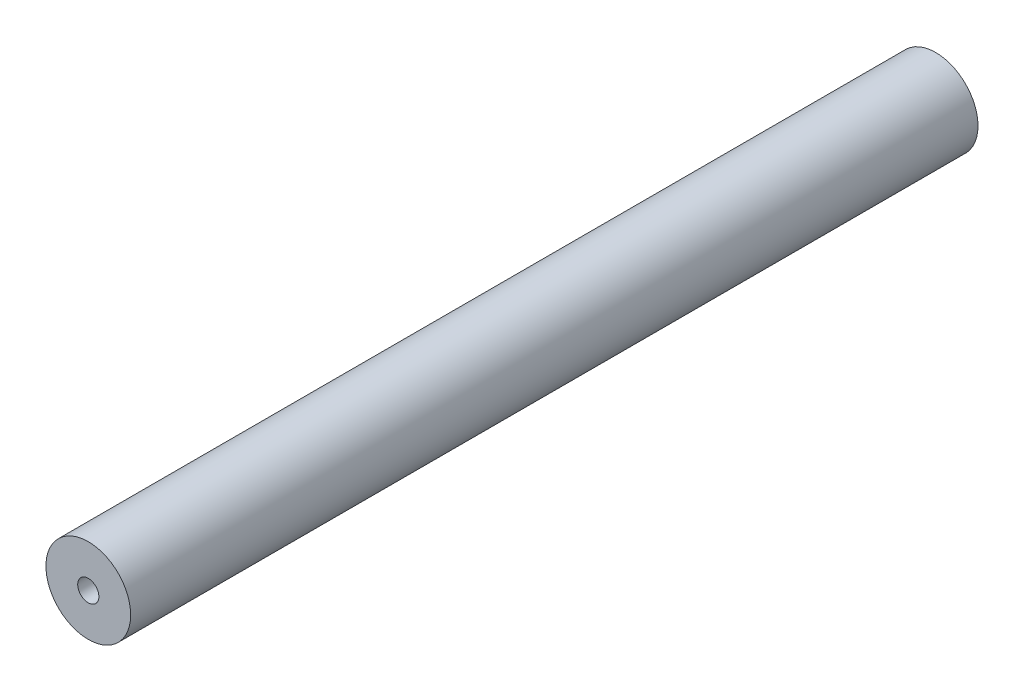
ISO-10303-21;
HEADER;
FILE_DESCRIPTION(('STEP AP214'),'2;1');
FILE_NAME('part.step','',(''),(''),'','','');
FILE_SCHEMA(('AUTOMOTIVE_DESIGN { 1 0 10303 214 1 1 1 1 }'));
ENDSEC;
DATA;
#1=APPLICATION_CONTEXT('core data for automotive mechanical design processes');
#2=APPLICATION_PROTOCOL_DEFINITION('international standard','automotive_design',2000,#1);
#3=PRODUCT_CONTEXT('',#1,'mechanical');
#4=PRODUCT('Part','Part','',(#3));
#5=PRODUCT_RELATED_PRODUCT_CATEGORY('part','',(#4));
#6=PRODUCT_DEFINITION_FORMATION('','',#4);
#7=PRODUCT_DEFINITION_CONTEXT('part definition',#1,'design');
#8=PRODUCT_DEFINITION('design','',#6,#7);
#9=PRODUCT_DEFINITION_SHAPE('','',#8);
#10=(LENGTH_UNIT() NAMED_UNIT(*) SI_UNIT(.MILLI.,.METRE.));
#11=(NAMED_UNIT(*) PLANE_ANGLE_UNIT() SI_UNIT($,.RADIAN.));
#12=(NAMED_UNIT(*) SI_UNIT($,.STERADIAN.) SOLID_ANGLE_UNIT());
#13=UNCERTAINTY_MEASURE_WITH_UNIT(LENGTH_MEASURE(1.E-05),#10,'distance_accuracy_value','');
#14=(GEOMETRIC_REPRESENTATION_CONTEXT(3) GLOBAL_UNCERTAINTY_ASSIGNED_CONTEXT((#13)) GLOBAL_UNIT_ASSIGNED_CONTEXT((#10,
#11,#12)) REPRESENTATION_CONTEXT('',''));
#15=CARTESIAN_POINT('',(0.,0.,0.));
#16=DIRECTION('',(0.,0.,1.));
#17=DIRECTION('',(1.,0.,0.));
#18=AXIS2_PLACEMENT_3D('',#15,#16,#17);
#19=CARTESIAN_POINT('',(0.,0.,508.));
#20=DIRECTION('',(0.,0.,1.));
#21=DIRECTION('',(1.,0.,0.));
#22=AXIS2_PLACEMENT_3D('',#19,#20,#21);
#23=PLANE('',#22);
#24=CARTESIAN_POINT('',(0.,0.,508.));
#25=DIRECTION('',(0.,0.,1.));
#26=DIRECTION('',(1.,0.,0.));
#27=AXIS2_PLACEMENT_3D('',#24,#25,#26);
#28=CIRCLE('',#27,25.4);
#29=CARTESIAN_POINT('',(25.4,0.,508.));
#30=VERTEX_POINT('',#29);
#31=EDGE_CURVE('E10',#30,#30,#28,.T.);
#32=ORIENTED_EDGE('',*,*,#31,.T.);
#33=EDGE_LOOP('',(#32));
#34=FACE_BOUND('',#33,.T.);
#35=CARTESIAN_POINT('',(0.,0.,508.));
#36=DIRECTION('',(0.,0.,1.));
#37=DIRECTION('',(1.,0.,0.));
#38=AXIS2_PLACEMENT_3D('',#35,#36,#37);
#39=CIRCLE('',#38,6.35);
#40=CARTESIAN_POINT('',(6.35,0.,508.));
#41=VERTEX_POINT('',#40);
#42=EDGE_CURVE('E48',#41,#41,#39,.T.);
#43=ORIENTED_EDGE('',*,*,#42,.F.);
#44=EDGE_LOOP('',(#43));
#45=FACE_BOUND('',#44,.T.);
#46=ADVANCED_FACE('F37',(#34,#45),#23,.T.);
#47=CARTESIAN_POINT('',(0.,0.,0.));
#48=DIRECTION('',(0.,0.,1.));
#49=DIRECTION('',(1.,0.,0.));
#50=AXIS2_PLACEMENT_3D('',#47,#48,#49);
#51=PLANE('',#50);
#52=CARTESIAN_POINT('',(0.,0.,0.));
#53=DIRECTION('',(0.,0.,1.));
#54=DIRECTION('',(1.,0.,0.));
#55=AXIS2_PLACEMENT_3D('',#52,#53,#54);
#56=CIRCLE('',#55,25.4);
#57=CARTESIAN_POINT('',(25.4,0.,0.));
#58=VERTEX_POINT('',#57);
#59=EDGE_CURVE('E41',#58,#58,#56,.T.);
#60=ORIENTED_EDGE('',*,*,#59,.F.);
#61=EDGE_LOOP('',(#60));
#62=FACE_BOUND('',#61,.T.);
#63=CARTESIAN_POINT('',(0.,0.,0.));
#64=DIRECTION('',(0.,0.,1.));
#65=DIRECTION('',(1.,0.,0.));
#66=AXIS2_PLACEMENT_3D('',#63,#64,#65);
#67=CIRCLE('',#66,6.35);
#68=CARTESIAN_POINT('',(6.35,0.,0.));
#69=VERTEX_POINT('',#68);
#70=EDGE_CURVE('E50',#69,#69,#67,.T.);
#71=ORIENTED_EDGE('',*,*,#70,.T.);
#72=EDGE_LOOP('',(#71));
#73=FACE_BOUND('',#72,.T.);
#74=ADVANCED_FACE('F60',(#62,#73),#51,.F.);
#75=CARTESIAN_POINT('',(0.,0.,508.));
#76=DIRECTION('',(0.,0.,-1.));
#77=DIRECTION('',(-1.,0.,0.));
#78=AXIS2_PLACEMENT_3D('',#75,#76,#77);
#79=CYLINDRICAL_SURFACE('',#78,25.4);
#80=ORIENTED_EDGE('',*,*,#31,.F.);
#81=EDGE_LOOP('',(#80));
#82=FACE_BOUND('',#81,.T.);
#83=ORIENTED_EDGE('',*,*,#59,.T.);
#84=EDGE_LOOP('',(#83));
#85=FACE_BOUND('',#84,.T.);
#86=ADVANCED_FACE('F39',(#82,#85),#79,.T.);
#87=CARTESIAN_POINT('',(0.,0.,508.));
#88=DIRECTION('',(0.,0.,-1.));
#89=DIRECTION('',(-1.,0.,0.));
#90=AXIS2_PLACEMENT_3D('',#87,#88,#89);
#91=CYLINDRICAL_SURFACE('',#90,6.35);
#92=ORIENTED_EDGE('',*,*,#42,.T.);
#93=EDGE_LOOP('',(#92));
#94=FACE_BOUND('',#93,.T.);
#95=ORIENTED_EDGE('',*,*,#70,.F.);
#96=EDGE_LOOP('',(#95));
#97=FACE_BOUND('',#96,.T.);
#98=ADVANCED_FACE('F56',(#94,#97),#91,.F.);
#99=CLOSED_SHELL('',(#46,#74,#86,#98));
#100=MANIFOLD_SOLID_BREP('B2',#99);
#101=ADVANCED_BREP_SHAPE_REPRESENTATION('',(#18,#100),#14);
#102=SHAPE_DEFINITION_REPRESENTATION(#9,#101);
ENDSEC;
END-ISO-10303-21;
